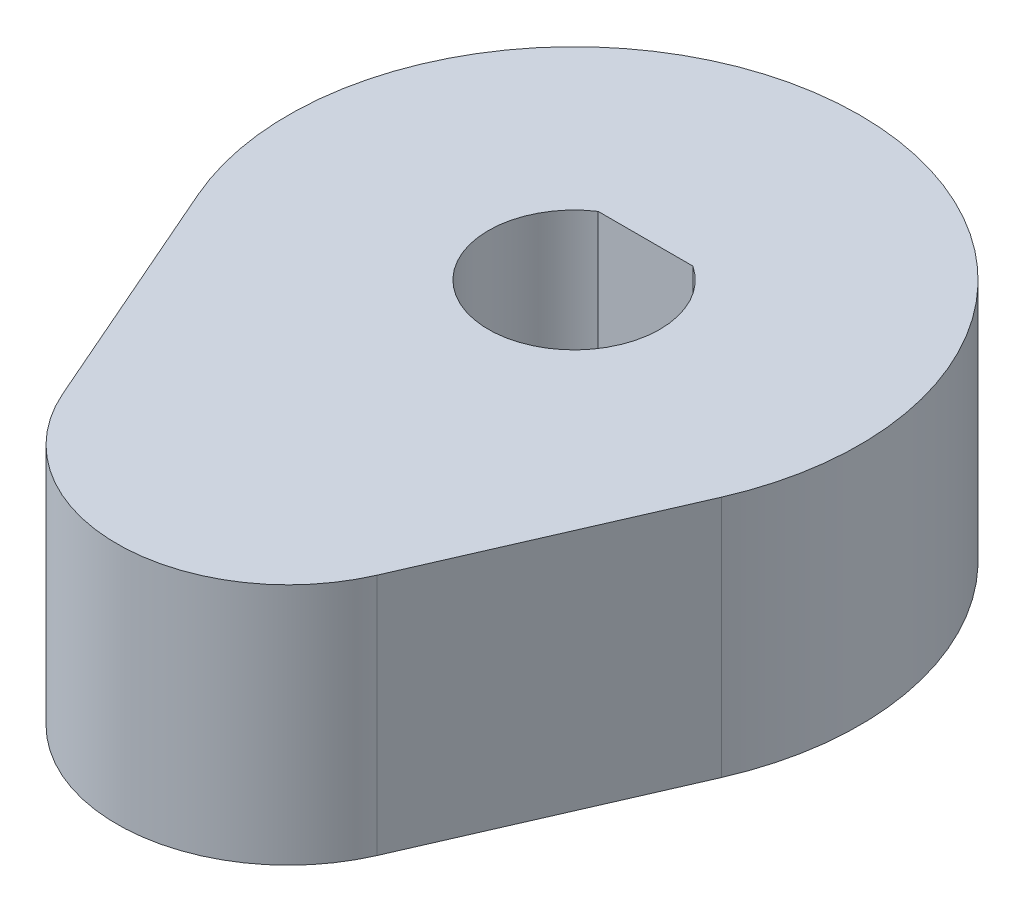
ISO-10303-21;
HEADER;
FILE_DESCRIPTION(('STEP AP214'),'2;1');
FILE_NAME('part.step','',(''),(''),'','','');
FILE_SCHEMA(('AUTOMOTIVE_DESIGN { 1 0 10303 214 1 1 1 1 }'));
ENDSEC;
DATA;
#1=APPLICATION_CONTEXT('core data for automotive mechanical design processes');
#2=APPLICATION_PROTOCOL_DEFINITION('international standard','automotive_design',2000,#1);
#3=PRODUCT_CONTEXT('',#1,'mechanical');
#4=PRODUCT('Part','Part','',(#3));
#5=PRODUCT_RELATED_PRODUCT_CATEGORY('part','',(#4));
#6=PRODUCT_DEFINITION_FORMATION('','',#4);
#7=PRODUCT_DEFINITION_CONTEXT('part definition',#1,'design');
#8=PRODUCT_DEFINITION('design','',#6,#7);
#9=PRODUCT_DEFINITION_SHAPE('','',#8);
#10=(LENGTH_UNIT() NAMED_UNIT(*) SI_UNIT(.MILLI.,.METRE.));
#11=(NAMED_UNIT(*) PLANE_ANGLE_UNIT() SI_UNIT($,.RADIAN.));
#12=(NAMED_UNIT(*) SI_UNIT($,.STERADIAN.) SOLID_ANGLE_UNIT());
#13=UNCERTAINTY_MEASURE_WITH_UNIT(LENGTH_MEASURE(1.E-05),#10,'distance_accuracy_value','');
#14=(GEOMETRIC_REPRESENTATION_CONTEXT(3) GLOBAL_UNCERTAINTY_ASSIGNED_CONTEXT((#13)) GLOBAL_UNIT_ASSIGNED_CONTEXT((#10,
#11,#12)) REPRESENTATION_CONTEXT('',''));
#15=CARTESIAN_POINT('',(0.,0.,0.));
#16=DIRECTION('',(0.,0.,1.));
#17=DIRECTION('',(1.,0.,0.));
#18=AXIS2_PLACEMENT_3D('',#15,#16,#17);
#19=CARTESIAN_POINT('',(0.,8.5,0.));
#20=DIRECTION('',(0.,1.,0.));
#21=DIRECTION('',(0.,0.,1.));
#22=AXIS2_PLACEMENT_3D('',#19,#20,#21);
#23=PLANE('',#22);
#24=CARTESIAN_POINT('',(0.,8.5,0.));
#25=DIRECTION('',(0.,1.,0.));
#26=DIRECTION('',(0.,0.,1.));
#27=AXIS2_PLACEMENT_3D('',#24,#25,#26);
#28=CIRCLE('',#27,10.);
#29=CARTESIAN_POINT('',(9.16515138991168,8.5,4.));
#30=VERTEX_POINT('',#29);
#31=CARTESIAN_POINT('',(-9.16515138991168,8.5,4.));
#32=VERTEX_POINT('',#31);
#33=EDGE_CURVE('E119',#30,#32,#28,.T.);
#34=ORIENTED_EDGE('',*,*,#33,.T.);
#35=DIRECTION('',(0.4,0.,0.916515138991168));
#36=VECTOR('',#35,1.);
#37=CARTESIAN_POINT('',(-9.16515138991168,8.5,4.));
#38=LINE('',#37,#36);
#39=CARTESIAN_POINT('',(-5.49909083394701,8.5,12.4));
#40=VERTEX_POINT('',#39);
#41=EDGE_CURVE('E123',#32,#40,#38,.T.);
#42=ORIENTED_EDGE('',*,*,#41,.T.);
#43=CARTESIAN_POINT('',(0.,8.5,10.));
#44=DIRECTION('',(0.,1.,0.));
#45=DIRECTION('',(0.,0.,1.));
#46=AXIS2_PLACEMENT_3D('',#43,#44,#45);
#47=CIRCLE('',#46,6.);
#48=CARTESIAN_POINT('',(5.49909083394701,8.5,12.4));
#49=VERTEX_POINT('',#48);
#50=EDGE_CURVE('E127',#40,#49,#47,.T.);
#51=ORIENTED_EDGE('',*,*,#50,.T.);
#52=DIRECTION('',(0.4,0.,-0.916515138991168));
#53=VECTOR('',#52,1.);
#54=CARTESIAN_POINT('',(9.16515138991168,8.5,4.));
#55=LINE('',#54,#53);
#56=EDGE_CURVE('E130',#49,#30,#55,.T.);
#57=ORIENTED_EDGE('',*,*,#56,.T.);
#58=EDGE_LOOP('',(#34,#42,#51,#57));
#59=FACE_BOUND('',#58,.T.);
#60=DIRECTION('',(-1.,0.,0.));
#61=VECTOR('',#60,1.);
#62=CARTESIAN_POINT('',(1.65830154074463,8.5,-2.5));
#63=LINE('',#62,#61);
#64=CARTESIAN_POINT('',(1.65830154074463,8.5,-2.5));
#65=VERTEX_POINT('',#64);
#66=CARTESIAN_POINT('',(-1.65830154074463,8.5,-2.5));
#67=VERTEX_POINT('',#66);
#68=EDGE_CURVE('E96',#65,#67,#63,.T.);
#69=ORIENTED_EDGE('',*,*,#68,.F.);
#70=CARTESIAN_POINT('',(0.,8.5,0.));
#71=DIRECTION('',(0.,1.,0.));
#72=DIRECTION('',(0.,0.,1.));
#73=AXIS2_PLACEMENT_3D('',#70,#71,#72);
#74=CIRCLE('',#73,2.999994);
#75=EDGE_CURVE('E103',#67,#65,#74,.T.);
#76=ORIENTED_EDGE('',*,*,#75,.F.);
#77=EDGE_LOOP('',(#69,#76));
#78=FACE_BOUND('',#77,.T.);
#79=ADVANCED_FACE('F43',(#59,#78),#23,.T.);
#80=CARTESIAN_POINT('',(0.,0.,0.));
#81=DIRECTION('',(0.,1.,0.));
#82=DIRECTION('',(0.,0.,1.));
#83=AXIS2_PLACEMENT_3D('',#80,#81,#82);
#84=PLANE('',#83);
#85=CARTESIAN_POINT('',(0.,0.,0.));
#86=DIRECTION('',(0.,1.,0.));
#87=DIRECTION('',(0.,0.,1.));
#88=AXIS2_PLACEMENT_3D('',#85,#86,#87);
#89=CIRCLE('',#88,10.);
#90=CARTESIAN_POINT('',(9.16515138991168,0.,4.));
#91=VERTEX_POINT('',#90);
#92=CARTESIAN_POINT('',(-9.16515138991168,0.,4.));
#93=VERTEX_POINT('',#92);
#94=EDGE_CURVE('E118',#91,#93,#89,.T.);
#95=ORIENTED_EDGE('',*,*,#94,.F.);
#96=DIRECTION('',(0.4,0.,-0.916515138991168));
#97=VECTOR('',#96,1.);
#98=CARTESIAN_POINT('',(9.16515138991168,0.,4.));
#99=LINE('',#98,#97);
#100=CARTESIAN_POINT('',(5.49909083394701,0.,12.4));
#101=VERTEX_POINT('',#100);
#102=EDGE_CURVE('E124',#101,#91,#99,.T.);
#103=ORIENTED_EDGE('',*,*,#102,.F.);
#104=CARTESIAN_POINT('',(0.,0.,10.));
#105=DIRECTION('',(0.,1.,0.));
#106=DIRECTION('',(0.,0.,1.));
#107=AXIS2_PLACEMENT_3D('',#104,#105,#106);
#108=CIRCLE('',#107,6.);
#109=CARTESIAN_POINT('',(-5.49909083394701,0.,12.4));
#110=VERTEX_POINT('',#109);
#111=EDGE_CURVE('E140',#110,#101,#108,.T.);
#112=ORIENTED_EDGE('',*,*,#111,.F.);
#113=DIRECTION('',(0.4,0.,0.916515138991168));
#114=VECTOR('',#113,1.);
#115=CARTESIAN_POINT('',(-9.16515138991168,0.,4.));
#116=LINE('',#115,#114);
#117=EDGE_CURVE('E137',#93,#110,#116,.T.);
#118=ORIENTED_EDGE('',*,*,#117,.F.);
#119=EDGE_LOOP('',(#95,#103,#112,#118));
#120=FACE_BOUND('',#119,.T.);
#121=CARTESIAN_POINT('',(0.,0.,0.));
#122=DIRECTION('',(0.,1.,0.));
#123=DIRECTION('',(0.,0.,1.));
#124=AXIS2_PLACEMENT_3D('',#121,#122,#123);
#125=CIRCLE('',#124,2.999994);
#126=CARTESIAN_POINT('',(-1.65830154074463,0.,-2.5));
#127=VERTEX_POINT('',#126);
#128=CARTESIAN_POINT('',(1.65830154074463,0.,-2.5));
#129=VERTEX_POINT('',#128);
#130=EDGE_CURVE('E66',#127,#129,#125,.T.);
#131=ORIENTED_EDGE('',*,*,#130,.T.);
#132=DIRECTION('',(-1.,0.,0.));
#133=VECTOR('',#132,1.);
#134=CARTESIAN_POINT('',(1.65830154074463,0.,-2.5));
#135=LINE('',#134,#133);
#136=EDGE_CURVE('E109',#129,#127,#135,.T.);
#137=ORIENTED_EDGE('',*,*,#136,.T.);
#138=EDGE_LOOP('',(#131,#137));
#139=FACE_BOUND('',#138,.T.);
#140=ADVANCED_FACE('F163',(#120,#139),#84,.F.);
#141=CARTESIAN_POINT('',(0.,8.5,0.));
#142=DIRECTION('',(0.,-1.,0.));
#143=DIRECTION('',(0.,0.,-1.));
#144=AXIS2_PLACEMENT_3D('',#141,#142,#143);
#145=CYLINDRICAL_SURFACE('',#144,10.);
#146=ORIENTED_EDGE('',*,*,#94,.T.);
#147=DIRECTION('',(0.,-1.,0.));
#148=VECTOR('',#147,1.);
#149=CARTESIAN_POINT('',(-9.16515138991168,8.5,4.));
#150=LINE('',#149,#148);
#151=EDGE_CURVE('E11',#32,#93,#150,.T.);
#152=ORIENTED_EDGE('',*,*,#151,.F.);
#153=ORIENTED_EDGE('',*,*,#33,.F.);
#154=DIRECTION('',(0.,-1.,0.));
#155=VECTOR('',#154,1.);
#156=CARTESIAN_POINT('',(9.16515138991168,8.5,4.));
#157=LINE('',#156,#155);
#158=EDGE_CURVE('E133',#30,#91,#157,.T.);
#159=ORIENTED_EDGE('',*,*,#158,.T.);
#160=EDGE_LOOP('',(#146,#152,#153,#159));
#161=FACE_BOUND('',#160,.T.);
#162=ADVANCED_FACE('F45',(#161),#145,.T.);
#163=CARTESIAN_POINT('',(-9.16515138991168,8.5,4.));
#164=DIRECTION('',(0.916515138991168,0.,-0.4));
#165=DIRECTION('',(-0.4,0.,-0.916515138991168));
#166=AXIS2_PLACEMENT_3D('',#163,#164,#165);
#167=PLANE('',#166);
#168=ORIENTED_EDGE('',*,*,#117,.T.);
#169=DIRECTION('',(0.,-1.,0.));
#170=VECTOR('',#169,1.);
#171=CARTESIAN_POINT('',(-5.49909083394701,8.5,12.4));
#172=LINE('',#171,#170);
#173=EDGE_CURVE('E52',#40,#110,#172,.T.);
#174=ORIENTED_EDGE('',*,*,#173,.F.);
#175=ORIENTED_EDGE('',*,*,#41,.F.);
#176=ORIENTED_EDGE('',*,*,#151,.T.);
#177=EDGE_LOOP('',(#168,#174,#175,#176));
#178=FACE_BOUND('',#177,.T.);
#179=ADVANCED_FACE('F173',(#178),#167,.F.);
#180=CARTESIAN_POINT('',(0.,8.5,10.));
#181=DIRECTION('',(0.,-1.,0.));
#182=DIRECTION('',(0.,0.,-1.));
#183=AXIS2_PLACEMENT_3D('',#180,#181,#182);
#184=CYLINDRICAL_SURFACE('',#183,6.);
#185=ORIENTED_EDGE('',*,*,#111,.T.);
#186=DIRECTION('',(0.,-1.,0.));
#187=VECTOR('',#186,1.);
#188=CARTESIAN_POINT('',(5.49909083394701,8.5,12.4));
#189=LINE('',#188,#187);
#190=EDGE_CURVE('E148',#49,#101,#189,.T.);
#191=ORIENTED_EDGE('',*,*,#190,.F.);
#192=ORIENTED_EDGE('',*,*,#50,.F.);
#193=ORIENTED_EDGE('',*,*,#173,.T.);
#194=EDGE_LOOP('',(#185,#191,#192,#193));
#195=FACE_BOUND('',#194,.T.);
#196=ADVANCED_FACE('F157',(#195),#184,.T.);
#197=CARTESIAN_POINT('',(9.16515138991168,8.5,4.));
#198=DIRECTION('',(-0.916515138991168,0.,-0.4));
#199=DIRECTION('',(-0.4,0.,0.916515138991168));
#200=AXIS2_PLACEMENT_3D('',#197,#198,#199);
#201=PLANE('',#200);
#202=ORIENTED_EDGE('',*,*,#102,.T.);
#203=ORIENTED_EDGE('',*,*,#158,.F.);
#204=ORIENTED_EDGE('',*,*,#56,.F.);
#205=ORIENTED_EDGE('',*,*,#190,.T.);
#206=EDGE_LOOP('',(#202,#203,#204,#205));
#207=FACE_BOUND('',#206,.T.);
#208=ADVANCED_FACE('F167',(#207),#201,.F.);
#209=CARTESIAN_POINT('',(0.,8.5,0.));
#210=DIRECTION('',(0.,-1.,0.));
#211=DIRECTION('',(0.,0.,-1.));
#212=AXIS2_PLACEMENT_3D('',#209,#210,#211);
#213=CYLINDRICAL_SURFACE('',#212,2.999994);
#214=ORIENTED_EDGE('',*,*,#130,.F.);
#215=DIRECTION('',(0.,-1.,0.));
#216=VECTOR('',#215,1.);
#217=CARTESIAN_POINT('',(-1.65830154074463,8.5,-2.5));
#218=LINE('',#217,#216);
#219=EDGE_CURVE('E98',#67,#127,#218,.T.);
#220=ORIENTED_EDGE('',*,*,#219,.F.);
#221=ORIENTED_EDGE('',*,*,#75,.T.);
#222=DIRECTION('',(0.,-1.,0.));
#223=VECTOR('',#222,1.);
#224=CARTESIAN_POINT('',(1.65830154074463,8.5,-2.5));
#225=LINE('',#224,#223);
#226=EDGE_CURVE('E59',#65,#129,#225,.T.);
#227=ORIENTED_EDGE('',*,*,#226,.T.);
#228=EDGE_LOOP('',(#214,#220,#221,#227));
#229=FACE_BOUND('',#228,.T.);
#230=ADVANCED_FACE('F105',(#229),#213,.F.);
#231=CARTESIAN_POINT('',(1.65830154074463,8.5,-2.5));
#232=DIRECTION('',(0.,0.,1.));
#233=DIRECTION('',(1.,0.,0.));
#234=AXIS2_PLACEMENT_3D('',#231,#232,#233);
#235=PLANE('',#234);
#236=ORIENTED_EDGE('',*,*,#136,.F.);
#237=ORIENTED_EDGE('',*,*,#226,.F.);
#238=ORIENTED_EDGE('',*,*,#68,.T.);
#239=ORIENTED_EDGE('',*,*,#219,.T.);
#240=EDGE_LOOP('',(#236,#237,#238,#239));
#241=FACE_BOUND('',#240,.T.);
#242=ADVANCED_FACE('F97',(#241),#235,.T.);
#243=CLOSED_SHELL('',(#79,#140,#162,#179,#196,#208,#230,#242));
#244=MANIFOLD_SOLID_BREP('B2',#243);
#245=ADVANCED_BREP_SHAPE_REPRESENTATION('',(#18,#244),#14);
#246=SHAPE_DEFINITION_REPRESENTATION(#9,#245);
ENDSEC;
END-ISO-10303-21;
